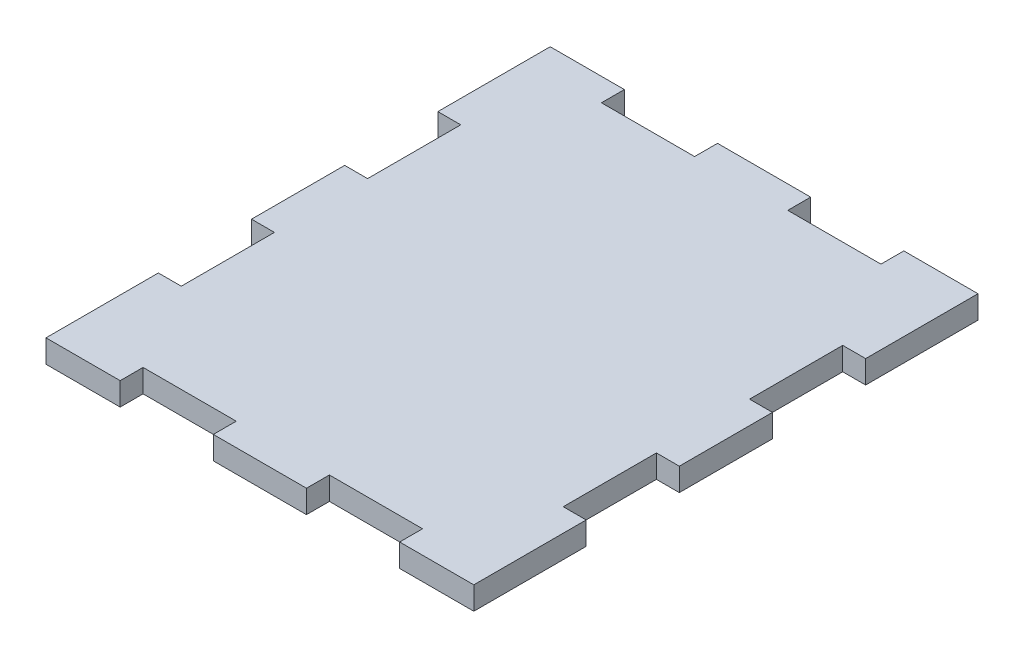
ISO-10303-21;
HEADER;
FILE_DESCRIPTION(('STEP AP214'),'2;1');
FILE_NAME('part.step','',(''),(''),'','','');
FILE_SCHEMA(('AUTOMOTIVE_DESIGN { 1 0 10303 214 1 1 1 1 }'));
ENDSEC;
DATA;
#1=APPLICATION_CONTEXT('core data for automotive mechanical design processes');
#2=APPLICATION_PROTOCOL_DEFINITION('international standard','automotive_design',2000,#1);
#3=PRODUCT_CONTEXT('',#1,'mechanical');
#4=PRODUCT('Part','Part','',(#3));
#5=PRODUCT_RELATED_PRODUCT_CATEGORY('part','',(#4));
#6=PRODUCT_DEFINITION_FORMATION('','',#4);
#7=PRODUCT_DEFINITION_CONTEXT('part definition',#1,'design');
#8=PRODUCT_DEFINITION('design','',#6,#7);
#9=PRODUCT_DEFINITION_SHAPE('','',#8);
#10=(LENGTH_UNIT() NAMED_UNIT(*) SI_UNIT(.MILLI.,.METRE.));
#11=(NAMED_UNIT(*) PLANE_ANGLE_UNIT() SI_UNIT($,.RADIAN.));
#12=(NAMED_UNIT(*) SI_UNIT($,.STERADIAN.) SOLID_ANGLE_UNIT());
#13=UNCERTAINTY_MEASURE_WITH_UNIT(LENGTH_MEASURE(1.E-05),#10,'distance_accuracy_value','');
#14=(GEOMETRIC_REPRESENTATION_CONTEXT(3) GLOBAL_UNCERTAINTY_ASSIGNED_CONTEXT((#13)) GLOBAL_UNIT_ASSIGNED_CONTEXT((#10,
#11,#12)) REPRESENTATION_CONTEXT('',''));
#15=CARTESIAN_POINT('',(0.,0.,0.));
#16=DIRECTION('',(0.,0.,1.));
#17=DIRECTION('',(1.,0.,0.));
#18=AXIS2_PLACEMENT_3D('',#15,#16,#17);
#19=CARTESIAN_POINT('',(19.415,6.,-270.));
#20=DIRECTION('',(0.,0.,1.));
#21=DIRECTION('',(1.,0.,0.));
#22=AXIS2_PLACEMENT_3D('',#19,#20,#21);
#23=PLANE('',#22);
#24=DIRECTION('',(-1.,0.,0.));
#25=VECTOR('',#24,1.);
#26=CARTESIAN_POINT('',(19.415,0.,-270.));
#27=LINE('',#26,#25);
#28=CARTESIAN_POINT('',(19.415,0.,-270.));
#29=VERTEX_POINT('',#28);
#30=CARTESIAN_POINT('',(0.,0.,-270.));
#31=VERTEX_POINT('',#30);
#32=EDGE_CURVE('E308',#29,#31,#27,.T.);
#33=ORIENTED_EDGE('',*,*,#32,.T.);
#34=DIRECTION('',(0.,-1.,0.));
#35=VECTOR('',#34,1.);
#36=CARTESIAN_POINT('',(0.,6.,-270.));
#37=LINE('',#36,#35);
#38=CARTESIAN_POINT('',(0.,6.,-270.));
#39=VERTEX_POINT('',#38);
#40=EDGE_CURVE('E11',#39,#31,#37,.T.);
#41=ORIENTED_EDGE('',*,*,#40,.F.);
#42=DIRECTION('',(-1.,0.,0.));
#43=VECTOR('',#42,1.);
#44=CARTESIAN_POINT('',(19.415,6.,-270.));
#45=LINE('',#44,#43);
#46=CARTESIAN_POINT('',(19.415,6.,-270.));
#47=VERTEX_POINT('',#46);
#48=EDGE_CURVE('E416',#47,#39,#45,.T.);
#49=ORIENTED_EDGE('',*,*,#48,.F.);
#50=DIRECTION('',(0.,-1.,0.));
#51=VECTOR('',#50,1.);
#52=CARTESIAN_POINT('',(19.415,6.,-270.));
#53=LINE('',#52,#51);
#54=EDGE_CURVE('E304',#47,#29,#53,.T.);
#55=ORIENTED_EDGE('',*,*,#54,.T.);
#56=EDGE_LOOP('',(#33,#41,#49,#55));
#57=FACE_BOUND('',#56,.T.);
#58=ADVANCED_FACE('F39',(#57),#23,.F.);
#59=CARTESIAN_POINT('',(0.,6.,-270.));
#60=DIRECTION('',(1.,0.,0.));
#61=DIRECTION('',(0.,0.,-1.));
#62=AXIS2_PLACEMENT_3D('',#59,#60,#61);
#63=PLANE('',#62);
#64=DIRECTION('',(0.,0.,1.));
#65=VECTOR('',#64,1.);
#66=CARTESIAN_POINT('',(0.,0.,-270.));
#67=LINE('',#66,#65);
#68=CARTESIAN_POINT('',(0.,0.,-240.585));
#69=VERTEX_POINT('',#68);
#70=EDGE_CURVE('E312',#31,#69,#67,.T.);
#71=ORIENTED_EDGE('',*,*,#70,.T.);
#72=DIRECTION('',(0.,-1.,0.));
#73=VECTOR('',#72,1.);
#74=CARTESIAN_POINT('',(0.,6.,-240.585));
#75=LINE('',#74,#73);
#76=CARTESIAN_POINT('',(0.,6.,-240.585));
#77=VERTEX_POINT('',#76);
#78=EDGE_CURVE('E48',#77,#69,#75,.T.);
#79=ORIENTED_EDGE('',*,*,#78,.F.);
#80=DIRECTION('',(0.,0.,1.));
#81=VECTOR('',#80,1.);
#82=CARTESIAN_POINT('',(0.,6.,-270.));
#83=LINE('',#82,#81);
#84=EDGE_CURVE('E183',#39,#77,#83,.T.);
#85=ORIENTED_EDGE('',*,*,#84,.F.);
#86=ORIENTED_EDGE('',*,*,#40,.T.);
#87=EDGE_LOOP('',(#71,#79,#85,#86));
#88=FACE_BOUND('',#87,.T.);
#89=ADVANCED_FACE('F678',(#88),#63,.F.);
#90=CARTESIAN_POINT('',(0.,6.,-240.585));
#91=DIRECTION('',(0.,0.,-1.));
#92=DIRECTION('',(-1.,0.,0.));
#93=AXIS2_PLACEMENT_3D('',#90,#91,#92);
#94=PLANE('',#93);
#95=DIRECTION('',(1.,0.,0.));
#96=VECTOR('',#95,1.);
#97=CARTESIAN_POINT('',(0.,0.,-240.585));
#98=LINE('',#97,#96);
#99=CARTESIAN_POINT('',(6.,0.,-240.585));
#100=VERTEX_POINT('',#99);
#101=EDGE_CURVE('E315',#69,#100,#98,.T.);
#102=ORIENTED_EDGE('',*,*,#101,.T.);
#103=DIRECTION('',(0.,-1.,0.));
#104=VECTOR('',#103,1.);
#105=CARTESIAN_POINT('',(6.,6.,-240.585));
#106=LINE('',#105,#104);
#107=CARTESIAN_POINT('',(6.,6.,-240.585));
#108=VERTEX_POINT('',#107);
#109=EDGE_CURVE('E539',#108,#100,#106,.T.);
#110=ORIENTED_EDGE('',*,*,#109,.F.);
#111=DIRECTION('',(1.,0.,0.));
#112=VECTOR('',#111,1.);
#113=CARTESIAN_POINT('',(0.,6.,-240.585));
#114=LINE('',#113,#112);
#115=EDGE_CURVE('E549',#77,#108,#114,.T.);
#116=ORIENTED_EDGE('',*,*,#115,.F.);
#117=ORIENTED_EDGE('',*,*,#78,.T.);
#118=EDGE_LOOP('',(#102,#110,#116,#117));
#119=FACE_BOUND('',#118,.T.);
#120=ADVANCED_FACE('F547',(#119),#94,.F.);
#121=CARTESIAN_POINT('',(6.,6.,-240.585));
#122=DIRECTION('',(1.,0.,0.));
#123=DIRECTION('',(0.,0.,-1.));
#124=AXIS2_PLACEMENT_3D('',#121,#122,#123);
#125=PLANE('',#124);
#126=DIRECTION('',(0.,0.,1.));
#127=VECTOR('',#126,1.);
#128=CARTESIAN_POINT('',(6.,0.,-240.585));
#129=LINE('',#128,#127);
#130=CARTESIAN_POINT('',(6.,0.,-216.195));
#131=VERTEX_POINT('',#130);
#132=EDGE_CURVE('E318',#100,#131,#129,.T.);
#133=ORIENTED_EDGE('',*,*,#132,.T.);
#134=DIRECTION('',(0.,-1.,0.));
#135=VECTOR('',#134,1.);
#136=CARTESIAN_POINT('',(6.,6.,-216.195));
#137=LINE('',#136,#135);
#138=CARTESIAN_POINT('',(6.,6.,-216.195));
#139=VERTEX_POINT('',#138);
#140=EDGE_CURVE('E535',#139,#131,#137,.T.);
#141=ORIENTED_EDGE('',*,*,#140,.F.);
#142=DIRECTION('',(0.,0.,1.));
#143=VECTOR('',#142,1.);
#144=CARTESIAN_POINT('',(6.,6.,-240.585));
#145=LINE('',#144,#143);
#146=EDGE_CURVE('E568',#108,#139,#145,.T.);
#147=ORIENTED_EDGE('',*,*,#146,.F.);
#148=ORIENTED_EDGE('',*,*,#109,.T.);
#149=EDGE_LOOP('',(#133,#141,#147,#148));
#150=FACE_BOUND('',#149,.T.);
#151=ADVANCED_FACE('F558',(#150),#125,.F.);
#152=CARTESIAN_POINT('',(6.,6.,-216.195));
#153=DIRECTION('',(0.,0.,1.));
#154=DIRECTION('',(1.,0.,0.));
#155=AXIS2_PLACEMENT_3D('',#152,#153,#154);
#156=PLANE('',#155);
#157=DIRECTION('',(-1.,0.,0.));
#158=VECTOR('',#157,1.);
#159=CARTESIAN_POINT('',(6.,0.,-216.195));
#160=LINE('',#159,#158);
#161=CARTESIAN_POINT('',(0.,0.,-216.195));
#162=VERTEX_POINT('',#161);
#163=EDGE_CURVE('E321',#131,#162,#160,.T.);
#164=ORIENTED_EDGE('',*,*,#163,.T.);
#165=DIRECTION('',(0.,-1.,0.));
#166=VECTOR('',#165,1.);
#167=CARTESIAN_POINT('',(0.,6.,-216.195));
#168=LINE('',#167,#166);
#169=CARTESIAN_POINT('',(0.,6.,-216.195));
#170=VERTEX_POINT('',#169);
#171=EDGE_CURVE('E531',#170,#162,#168,.T.);
#172=ORIENTED_EDGE('',*,*,#171,.F.);
#173=DIRECTION('',(-1.,0.,0.));
#174=VECTOR('',#173,1.);
#175=CARTESIAN_POINT('',(6.,6.,-216.195));
#176=LINE('',#175,#174);
#177=EDGE_CURVE('E564',#139,#170,#176,.T.);
#178=ORIENTED_EDGE('',*,*,#177,.F.);
#179=ORIENTED_EDGE('',*,*,#140,.T.);
#180=EDGE_LOOP('',(#164,#172,#178,#179));
#181=FACE_BOUND('',#180,.T.);
#182=ADVANCED_FACE('F562',(#181),#156,.F.);
#183=CARTESIAN_POINT('',(0.,6.,-216.195));
#184=DIRECTION('',(1.,0.,0.));
#185=DIRECTION('',(0.,0.,-1.));
#186=AXIS2_PLACEMENT_3D('',#183,#184,#185);
#187=PLANE('',#186);
#188=DIRECTION('',(0.,0.,1.));
#189=VECTOR('',#188,1.);
#190=CARTESIAN_POINT('',(0.,0.,-216.195));
#191=LINE('',#190,#189);
#192=CARTESIAN_POINT('',(0.,0.,-191.805));
#193=VERTEX_POINT('',#192);
#194=EDGE_CURVE('E324',#162,#193,#191,.T.);
#195=ORIENTED_EDGE('',*,*,#194,.T.);
#196=DIRECTION('',(0.,-1.,0.));
#197=VECTOR('',#196,1.);
#198=CARTESIAN_POINT('',(0.,6.,-191.805));
#199=LINE('',#198,#197);
#200=CARTESIAN_POINT('',(0.,6.,-191.805));
#201=VERTEX_POINT('',#200);
#202=EDGE_CURVE('E527',#201,#193,#199,.T.);
#203=ORIENTED_EDGE('',*,*,#202,.F.);
#204=DIRECTION('',(0.,0.,1.));
#205=VECTOR('',#204,1.);
#206=CARTESIAN_POINT('',(0.,6.,-216.195));
#207=LINE('',#206,#205);
#208=EDGE_CURVE('E567',#170,#201,#207,.T.);
#209=ORIENTED_EDGE('',*,*,#208,.F.);
#210=ORIENTED_EDGE('',*,*,#171,.T.);
#211=EDGE_LOOP('',(#195,#203,#209,#210));
#212=FACE_BOUND('',#211,.T.);
#213=ADVANCED_FACE('F691',(#212),#187,.F.);
#214=CARTESIAN_POINT('',(0.,6.,-191.805));
#215=DIRECTION('',(0.,0.,-1.));
#216=DIRECTION('',(-1.,0.,0.));
#217=AXIS2_PLACEMENT_3D('',#214,#215,#216);
#218=PLANE('',#217);
#219=DIRECTION('',(1.,0.,0.));
#220=VECTOR('',#219,1.);
#221=CARTESIAN_POINT('',(0.,0.,-191.805));
#222=LINE('',#221,#220);
#223=CARTESIAN_POINT('',(6.,0.,-191.805));
#224=VERTEX_POINT('',#223);
#225=EDGE_CURVE('E327',#193,#224,#222,.T.);
#226=ORIENTED_EDGE('',*,*,#225,.T.);
#227=DIRECTION('',(0.,-1.,0.));
#228=VECTOR('',#227,1.);
#229=CARTESIAN_POINT('',(6.,6.,-191.805));
#230=LINE('',#229,#228);
#231=CARTESIAN_POINT('',(6.,6.,-191.805));
#232=VERTEX_POINT('',#231);
#233=EDGE_CURVE('E523',#232,#224,#230,.T.);
#234=ORIENTED_EDGE('',*,*,#233,.F.);
#235=DIRECTION('',(1.,0.,0.));
#236=VECTOR('',#235,1.);
#237=CARTESIAN_POINT('',(0.,6.,-191.805));
#238=LINE('',#237,#236);
#239=EDGE_CURVE('E572',#201,#232,#238,.T.);
#240=ORIENTED_EDGE('',*,*,#239,.F.);
#241=ORIENTED_EDGE('',*,*,#202,.T.);
#242=EDGE_LOOP('',(#226,#234,#240,#241));
#243=FACE_BOUND('',#242,.T.);
#244=ADVANCED_FACE('F694',(#243),#218,.F.);
#245=CARTESIAN_POINT('',(6.,6.,-191.805));
#246=DIRECTION('',(1.,0.,0.));
#247=DIRECTION('',(0.,0.,-1.));
#248=AXIS2_PLACEMENT_3D('',#245,#246,#247);
#249=PLANE('',#248);
#250=DIRECTION('',(0.,0.,1.));
#251=VECTOR('',#250,1.);
#252=CARTESIAN_POINT('',(6.,0.,-191.805));
#253=LINE('',#252,#251);
#254=CARTESIAN_POINT('',(6.,0.,-167.415));
#255=VERTEX_POINT('',#254);
#256=EDGE_CURVE('E330',#224,#255,#253,.T.);
#257=ORIENTED_EDGE('',*,*,#256,.T.);
#258=DIRECTION('',(0.,-1.,0.));
#259=VECTOR('',#258,1.);
#260=CARTESIAN_POINT('',(6.,6.,-167.415));
#261=LINE('',#260,#259);
#262=CARTESIAN_POINT('',(6.,6.,-167.415));
#263=VERTEX_POINT('',#262);
#264=EDGE_CURVE('E519',#263,#255,#261,.T.);
#265=ORIENTED_EDGE('',*,*,#264,.F.);
#266=DIRECTION('',(0.,0.,1.));
#267=VECTOR('',#266,1.);
#268=CARTESIAN_POINT('',(6.,6.,-191.805));
#269=LINE('',#268,#267);
#270=EDGE_CURVE('E579',#232,#263,#269,.T.);
#271=ORIENTED_EDGE('',*,*,#270,.F.);
#272=ORIENTED_EDGE('',*,*,#233,.T.);
#273=EDGE_LOOP('',(#257,#265,#271,#272));
#274=FACE_BOUND('',#273,.T.);
#275=ADVANCED_FACE('F698',(#274),#249,.F.);
#276=CARTESIAN_POINT('',(6.,6.,-167.415));
#277=DIRECTION('',(0.,0.,1.));
#278=DIRECTION('',(1.,0.,0.));
#279=AXIS2_PLACEMENT_3D('',#276,#277,#278);
#280=PLANE('',#279);
#281=DIRECTION('',(-1.,0.,0.));
#282=VECTOR('',#281,1.);
#283=CARTESIAN_POINT('',(6.,0.,-167.415));
#284=LINE('',#283,#282);
#285=CARTESIAN_POINT('',(0.,0.,-167.415));
#286=VERTEX_POINT('',#285);
#287=EDGE_CURVE('E333',#255,#286,#284,.T.);
#288=ORIENTED_EDGE('',*,*,#287,.T.);
#289=DIRECTION('',(0.,-1.,0.));
#290=VECTOR('',#289,1.);
#291=CARTESIAN_POINT('',(0.,6.,-167.415));
#292=LINE('',#291,#290);
#293=CARTESIAN_POINT('',(0.,6.,-167.415));
#294=VERTEX_POINT('',#293);
#295=EDGE_CURVE('E515',#294,#286,#292,.T.);
#296=ORIENTED_EDGE('',*,*,#295,.F.);
#297=DIRECTION('',(-1.,0.,0.));
#298=VECTOR('',#297,1.);
#299=CARTESIAN_POINT('',(6.,6.,-167.415));
#300=LINE('',#299,#298);
#301=EDGE_CURVE('E582',#263,#294,#300,.T.);
#302=ORIENTED_EDGE('',*,*,#301,.F.);
#303=ORIENTED_EDGE('',*,*,#264,.T.);
#304=EDGE_LOOP('',(#288,#296,#302,#303));
#305=FACE_BOUND('',#304,.T.);
#306=ADVANCED_FACE('F702',(#305),#280,.F.);
#307=CARTESIAN_POINT('',(0.,6.,-143.025));
#308=DIRECTION('',(1.,0.,0.));
#309=DIRECTION('',(0.,0.,-1.));
#310=AXIS2_PLACEMENT_3D('',#307,#308,#309);
#311=PLANE('',#310);
#312=DIRECTION('',(0.,0.,1.));
#313=VECTOR('',#312,1.);
#314=CARTESIAN_POINT('',(0.,0.,-143.025));
#315=LINE('',#314,#313);
#316=CARTESIAN_POINT('',(0.,0.,-138.));
#317=VERTEX_POINT('',#316);
#318=EDGE_CURVE('E337',#286,#317,#315,.T.);
#319=ORIENTED_EDGE('',*,*,#318,.T.);
#320=DIRECTION('',(0.,-1.,0.));
#321=VECTOR('',#320,1.);
#322=CARTESIAN_POINT('',(0.,6.,-138.));
#323=LINE('',#322,#321);
#324=CARTESIAN_POINT('',(0.,6.,-138.));
#325=VERTEX_POINT('',#324);
#326=EDGE_CURVE('E511',#325,#317,#323,.T.);
#327=ORIENTED_EDGE('',*,*,#326,.F.);
#328=DIRECTION('',(0.,0.,1.));
#329=VECTOR('',#328,1.);
#330=CARTESIAN_POINT('',(0.,6.,-167.415));
#331=LINE('',#330,#329);
#332=EDGE_CURVE('E585',#294,#325,#331,.T.);
#333=ORIENTED_EDGE('',*,*,#332,.F.);
#334=ORIENTED_EDGE('',*,*,#295,.T.);
#335=EDGE_LOOP('',(#319,#327,#333,#334));
#336=FACE_BOUND('',#335,.T.);
#337=ADVANCED_FACE('F706',(#336),#311,.F.);
#338=CARTESIAN_POINT('',(0.,6.,-138.));
#339=DIRECTION('',(0.,0.,-1.));
#340=DIRECTION('',(-1.,0.,0.));
#341=AXIS2_PLACEMENT_3D('',#338,#339,#340);
#342=PLANE('',#341);
#343=DIRECTION('',(1.,0.,0.));
#344=VECTOR('',#343,1.);
#345=CARTESIAN_POINT('',(0.,0.,-138.));
#346=LINE('',#345,#344);
#347=CARTESIAN_POINT('',(19.415,0.,-138.));
#348=VERTEX_POINT('',#347);
#349=EDGE_CURVE('E340',#317,#348,#346,.T.);
#350=ORIENTED_EDGE('',*,*,#349,.T.);
#351=DIRECTION('',(0.,-1.,0.));
#352=VECTOR('',#351,1.);
#353=CARTESIAN_POINT('',(19.415,6.,-138.));
#354=LINE('',#353,#352);
#355=CARTESIAN_POINT('',(19.415,6.,-138.));
#356=VERTEX_POINT('',#355);
#357=EDGE_CURVE('E507',#356,#348,#354,.T.);
#358=ORIENTED_EDGE('',*,*,#357,.F.);
#359=DIRECTION('',(1.,0.,0.));
#360=VECTOR('',#359,1.);
#361=CARTESIAN_POINT('',(0.,6.,-138.));
#362=LINE('',#361,#360);
#363=EDGE_CURVE('E588',#325,#356,#362,.T.);
#364=ORIENTED_EDGE('',*,*,#363,.F.);
#365=ORIENTED_EDGE('',*,*,#326,.T.);
#366=EDGE_LOOP('',(#350,#358,#364,#365));
#367=FACE_BOUND('',#366,.T.);
#368=ADVANCED_FACE('F710',(#367),#342,.F.);
#369=CARTESIAN_POINT('',(19.415,6.,-138.));
#370=DIRECTION('',(-1.,0.,0.));
#371=DIRECTION('',(0.,0.,1.));
#372=AXIS2_PLACEMENT_3D('',#369,#370,#371);
#373=PLANE('',#372);
#374=DIRECTION('',(0.,0.,-1.));
#375=VECTOR('',#374,1.);
#376=CARTESIAN_POINT('',(19.415,0.,-138.));
#377=LINE('',#376,#375);
#378=CARTESIAN_POINT('',(19.415,0.,-144.));
#379=VERTEX_POINT('',#378);
#380=EDGE_CURVE('E343',#348,#379,#377,.T.);
#381=ORIENTED_EDGE('',*,*,#380,.T.);
#382=DIRECTION('',(0.,-1.,0.));
#383=VECTOR('',#382,1.);
#384=CARTESIAN_POINT('',(19.415,6.,-144.));
#385=LINE('',#384,#383);
#386=CARTESIAN_POINT('',(19.415,6.,-144.));
#387=VERTEX_POINT('',#386);
#388=EDGE_CURVE('E503',#387,#379,#385,.T.);
#389=ORIENTED_EDGE('',*,*,#388,.F.);
#390=DIRECTION('',(0.,0.,-1.));
#391=VECTOR('',#390,1.);
#392=CARTESIAN_POINT('',(19.415,6.,-138.));
#393=LINE('',#392,#391);
#394=EDGE_CURVE('E591',#356,#387,#393,.T.);
#395=ORIENTED_EDGE('',*,*,#394,.F.);
#396=ORIENTED_EDGE('',*,*,#357,.T.);
#397=EDGE_LOOP('',(#381,#389,#395,#396));
#398=FACE_BOUND('',#397,.T.);
#399=ADVANCED_FACE('F714',(#398),#373,.F.);
#400=CARTESIAN_POINT('',(19.415,6.,-144.));
#401=DIRECTION('',(0.,0.,-1.));
#402=DIRECTION('',(-1.,0.,0.));
#403=AXIS2_PLACEMENT_3D('',#400,#401,#402);
#404=PLANE('',#403);
#405=DIRECTION('',(1.,0.,0.));
#406=VECTOR('',#405,1.);
#407=CARTESIAN_POINT('',(19.415,0.,-144.));
#408=LINE('',#407,#406);
#409=CARTESIAN_POINT('',(43.805,0.,-144.));
#410=VERTEX_POINT('',#409);
#411=EDGE_CURVE('E346',#379,#410,#408,.T.);
#412=ORIENTED_EDGE('',*,*,#411,.T.);
#413=DIRECTION('',(0.,-1.,0.));
#414=VECTOR('',#413,1.);
#415=CARTESIAN_POINT('',(43.805,6.,-144.));
#416=LINE('',#415,#414);
#417=CARTESIAN_POINT('',(43.805,6.,-144.));
#418=VERTEX_POINT('',#417);
#419=EDGE_CURVE('E499',#418,#410,#416,.T.);
#420=ORIENTED_EDGE('',*,*,#419,.F.);
#421=DIRECTION('',(1.,0.,0.));
#422=VECTOR('',#421,1.);
#423=CARTESIAN_POINT('',(19.415,6.,-144.));
#424=LINE('',#423,#422);
#425=EDGE_CURVE('E594',#387,#418,#424,.T.);
#426=ORIENTED_EDGE('',*,*,#425,.F.);
#427=ORIENTED_EDGE('',*,*,#388,.T.);
#428=EDGE_LOOP('',(#412,#420,#426,#427));
#429=FACE_BOUND('',#428,.T.);
#430=ADVANCED_FACE('F718',(#429),#404,.F.);
#431=CARTESIAN_POINT('',(43.805,6.,-144.));
#432=DIRECTION('',(1.,0.,0.));
#433=DIRECTION('',(0.,0.,-1.));
#434=AXIS2_PLACEMENT_3D('',#431,#432,#433);
#435=PLANE('',#434);
#436=DIRECTION('',(0.,0.,1.));
#437=VECTOR('',#436,1.);
#438=CARTESIAN_POINT('',(43.805,0.,-144.));
#439=LINE('',#438,#437);
#440=CARTESIAN_POINT('',(43.805,0.,-138.));
#441=VERTEX_POINT('',#440);
#442=EDGE_CURVE('E349',#410,#441,#439,.T.);
#443=ORIENTED_EDGE('',*,*,#442,.T.);
#444=DIRECTION('',(0.,-1.,0.));
#445=VECTOR('',#444,1.);
#446=CARTESIAN_POINT('',(43.805,6.,-138.));
#447=LINE('',#446,#445);
#448=CARTESIAN_POINT('',(43.805,6.,-138.));
#449=VERTEX_POINT('',#448);
#450=EDGE_CURVE('E495',#449,#441,#447,.T.);
#451=ORIENTED_EDGE('',*,*,#450,.F.);
#452=DIRECTION('',(0.,0.,1.));
#453=VECTOR('',#452,1.);
#454=CARTESIAN_POINT('',(43.805,6.,-144.));
#455=LINE('',#454,#453);
#456=EDGE_CURVE('E597',#418,#449,#455,.T.);
#457=ORIENTED_EDGE('',*,*,#456,.F.);
#458=ORIENTED_EDGE('',*,*,#419,.T.);
#459=EDGE_LOOP('',(#443,#451,#457,#458));
#460=FACE_BOUND('',#459,.T.);
#461=ADVANCED_FACE('F722',(#460),#435,.F.);
#462=CARTESIAN_POINT('',(43.805,6.,-138.));
#463=DIRECTION('',(0.,0.,-1.));
#464=DIRECTION('',(-1.,0.,0.));
#465=AXIS2_PLACEMENT_3D('',#462,#463,#464);
#466=PLANE('',#465);
#467=DIRECTION('',(1.,0.,0.));
#468=VECTOR('',#467,1.);
#469=CARTESIAN_POINT('',(43.805,0.,-138.));
#470=LINE('',#469,#468);
#471=CARTESIAN_POINT('',(68.195,0.,-138.));
#472=VERTEX_POINT('',#471);
#473=EDGE_CURVE('E352',#441,#472,#470,.T.);
#474=ORIENTED_EDGE('',*,*,#473,.T.);
#475=DIRECTION('',(0.,-1.,0.));
#476=VECTOR('',#475,1.);
#477=CARTESIAN_POINT('',(68.195,6.,-138.));
#478=LINE('',#477,#476);
#479=CARTESIAN_POINT('',(68.195,6.,-138.));
#480=VERTEX_POINT('',#479);
#481=EDGE_CURVE('E491',#480,#472,#478,.T.);
#482=ORIENTED_EDGE('',*,*,#481,.F.);
#483=DIRECTION('',(1.,0.,0.));
#484=VECTOR('',#483,1.);
#485=CARTESIAN_POINT('',(43.805,6.,-138.));
#486=LINE('',#485,#484);
#487=EDGE_CURVE('E600',#449,#480,#486,.T.);
#488=ORIENTED_EDGE('',*,*,#487,.F.);
#489=ORIENTED_EDGE('',*,*,#450,.T.);
#490=EDGE_LOOP('',(#474,#482,#488,#489));
#491=FACE_BOUND('',#490,.T.);
#492=ADVANCED_FACE('F726',(#491),#466,.F.);
#493=CARTESIAN_POINT('',(68.195,6.,-138.));
#494=DIRECTION('',(-1.,0.,0.));
#495=DIRECTION('',(0.,0.,1.));
#496=AXIS2_PLACEMENT_3D('',#493,#494,#495);
#497=PLANE('',#496);
#498=DIRECTION('',(0.,0.,-1.));
#499=VECTOR('',#498,1.);
#500=CARTESIAN_POINT('',(68.195,0.,-138.));
#501=LINE('',#500,#499);
#502=CARTESIAN_POINT('',(68.195,0.,-144.));
#503=VERTEX_POINT('',#502);
#504=EDGE_CURVE('E355',#472,#503,#501,.T.);
#505=ORIENTED_EDGE('',*,*,#504,.T.);
#506=DIRECTION('',(0.,-1.,0.));
#507=VECTOR('',#506,1.);
#508=CARTESIAN_POINT('',(68.195,6.,-144.));
#509=LINE('',#508,#507);
#510=CARTESIAN_POINT('',(68.195,6.,-144.));
#511=VERTEX_POINT('',#510);
#512=EDGE_CURVE('E487',#511,#503,#509,.T.);
#513=ORIENTED_EDGE('',*,*,#512,.F.);
#514=DIRECTION('',(0.,0.,-1.));
#515=VECTOR('',#514,1.);
#516=CARTESIAN_POINT('',(68.195,6.,-138.));
#517=LINE('',#516,#515);
#518=EDGE_CURVE('E603',#480,#511,#517,.T.);
#519=ORIENTED_EDGE('',*,*,#518,.F.);
#520=ORIENTED_EDGE('',*,*,#481,.T.);
#521=EDGE_LOOP('',(#505,#513,#519,#520));
#522=FACE_BOUND('',#521,.T.);
#523=ADVANCED_FACE('F730',(#522),#497,.F.);
#524=CARTESIAN_POINT('',(68.195,6.,-144.));
#525=DIRECTION('',(0.,0.,-1.));
#526=DIRECTION('',(-1.,0.,0.));
#527=AXIS2_PLACEMENT_3D('',#524,#525,#526);
#528=PLANE('',#527);
#529=DIRECTION('',(1.,0.,0.));
#530=VECTOR('',#529,1.);
#531=CARTESIAN_POINT('',(68.195,0.,-144.));
#532=LINE('',#531,#530);
#533=CARTESIAN_POINT('',(92.585,0.,-144.));
#534=VERTEX_POINT('',#533);
#535=EDGE_CURVE('E358',#503,#534,#532,.T.);
#536=ORIENTED_EDGE('',*,*,#535,.T.);
#537=DIRECTION('',(0.,-1.,0.));
#538=VECTOR('',#537,1.);
#539=CARTESIAN_POINT('',(92.585,6.,-144.));
#540=LINE('',#539,#538);
#541=CARTESIAN_POINT('',(92.585,6.,-144.));
#542=VERTEX_POINT('',#541);
#543=EDGE_CURVE('E483',#542,#534,#540,.T.);
#544=ORIENTED_EDGE('',*,*,#543,.F.);
#545=DIRECTION('',(1.,0.,0.));
#546=VECTOR('',#545,1.);
#547=CARTESIAN_POINT('',(68.195,6.,-144.));
#548=LINE('',#547,#546);
#549=EDGE_CURVE('E606',#511,#542,#548,.T.);
#550=ORIENTED_EDGE('',*,*,#549,.F.);
#551=ORIENTED_EDGE('',*,*,#512,.T.);
#552=EDGE_LOOP('',(#536,#544,#550,#551));
#553=FACE_BOUND('',#552,.T.);
#554=ADVANCED_FACE('F734',(#553),#528,.F.);
#555=CARTESIAN_POINT('',(92.585,6.,-144.));
#556=DIRECTION('',(1.,0.,0.));
#557=DIRECTION('',(0.,0.,-1.));
#558=AXIS2_PLACEMENT_3D('',#555,#556,#557);
#559=PLANE('',#558);
#560=DIRECTION('',(0.,0.,1.));
#561=VECTOR('',#560,1.);
#562=CARTESIAN_POINT('',(92.585,0.,-144.));
#563=LINE('',#562,#561);
#564=CARTESIAN_POINT('',(92.585,0.,-138.));
#565=VERTEX_POINT('',#564);
#566=EDGE_CURVE('E361',#534,#565,#563,.T.);
#567=ORIENTED_EDGE('',*,*,#566,.T.);
#568=DIRECTION('',(0.,-1.,0.));
#569=VECTOR('',#568,1.);
#570=CARTESIAN_POINT('',(92.585,6.,-138.));
#571=LINE('',#570,#569);
#572=CARTESIAN_POINT('',(92.585,6.,-138.));
#573=VERTEX_POINT('',#572);
#574=EDGE_CURVE('E479',#573,#565,#571,.T.);
#575=ORIENTED_EDGE('',*,*,#574,.F.);
#576=DIRECTION('',(0.,0.,1.));
#577=VECTOR('',#576,1.);
#578=CARTESIAN_POINT('',(92.585,6.,-144.));
#579=LINE('',#578,#577);
#580=EDGE_CURVE('E609',#542,#573,#579,.T.);
#581=ORIENTED_EDGE('',*,*,#580,.F.);
#582=ORIENTED_EDGE('',*,*,#543,.T.);
#583=EDGE_LOOP('',(#567,#575,#581,#582));
#584=FACE_BOUND('',#583,.T.);
#585=ADVANCED_FACE('F738',(#584),#559,.F.);
#586=CARTESIAN_POINT('',(92.585,6.,-138.));
#587=DIRECTION('',(0.,0.,-1.));
#588=DIRECTION('',(-1.,0.,0.));
#589=AXIS2_PLACEMENT_3D('',#586,#587,#588);
#590=PLANE('',#589);
#591=DIRECTION('',(1.,0.,0.));
#592=VECTOR('',#591,1.);
#593=CARTESIAN_POINT('',(92.585,0.,-138.));
#594=LINE('',#593,#592);
#595=CARTESIAN_POINT('',(112.,0.,-138.));
#596=VERTEX_POINT('',#595);
#597=EDGE_CURVE('E364',#565,#596,#594,.T.);
#598=ORIENTED_EDGE('',*,*,#597,.T.);
#599=DIRECTION('',(0.,-1.,0.));
#600=VECTOR('',#599,1.);
#601=CARTESIAN_POINT('',(112.,6.,-138.));
#602=LINE('',#601,#600);
#603=CARTESIAN_POINT('',(112.,6.,-138.));
#604=VERTEX_POINT('',#603);
#605=EDGE_CURVE('E475',#604,#596,#602,.T.);
#606=ORIENTED_EDGE('',*,*,#605,.F.);
#607=DIRECTION('',(1.,0.,0.));
#608=VECTOR('',#607,1.);
#609=CARTESIAN_POINT('',(92.585,6.,-138.));
#610=LINE('',#609,#608);
#611=EDGE_CURVE('E612',#573,#604,#610,.T.);
#612=ORIENTED_EDGE('',*,*,#611,.F.);
#613=ORIENTED_EDGE('',*,*,#574,.T.);
#614=EDGE_LOOP('',(#598,#606,#612,#613));
#615=FACE_BOUND('',#614,.T.);
#616=ADVANCED_FACE('F742',(#615),#590,.F.);
#617=CARTESIAN_POINT('',(112.,6.,-138.));
#618=DIRECTION('',(-1.,0.,0.));
#619=DIRECTION('',(0.,0.,1.));
#620=AXIS2_PLACEMENT_3D('',#617,#618,#619);
#621=PLANE('',#620);
#622=DIRECTION('',(0.,0.,-1.));
#623=VECTOR('',#622,1.);
#624=CARTESIAN_POINT('',(112.,0.,-138.));
#625=LINE('',#624,#623);
#626=CARTESIAN_POINT('',(112.,0.,-167.415));
#627=VERTEX_POINT('',#626);
#628=EDGE_CURVE('E367',#596,#627,#625,.T.);
#629=ORIENTED_EDGE('',*,*,#628,.T.);
#630=DIRECTION('',(0.,-1.,0.));
#631=VECTOR('',#630,1.);
#632=CARTESIAN_POINT('',(112.,6.,-167.415));
#633=LINE('',#632,#631);
#634=CARTESIAN_POINT('',(112.,6.,-167.415));
#635=VERTEX_POINT('',#634);
#636=EDGE_CURVE('E471',#635,#627,#633,.T.);
#637=ORIENTED_EDGE('',*,*,#636,.F.);
#638=DIRECTION('',(0.,0.,-1.));
#639=VECTOR('',#638,1.);
#640=CARTESIAN_POINT('',(112.,6.,-138.));
#641=LINE('',#640,#639);
#642=EDGE_CURVE('E615',#604,#635,#641,.T.);
#643=ORIENTED_EDGE('',*,*,#642,.F.);
#644=ORIENTED_EDGE('',*,*,#605,.T.);
#645=EDGE_LOOP('',(#629,#637,#643,#644));
#646=FACE_BOUND('',#645,.T.);
#647=ADVANCED_FACE('F746',(#646),#621,.F.);
#648=CARTESIAN_POINT('',(112.,6.,-167.415));
#649=DIRECTION('',(0.,0.,1.));
#650=DIRECTION('',(1.,0.,0.));
#651=AXIS2_PLACEMENT_3D('',#648,#649,#650);
#652=PLANE('',#651);
#653=DIRECTION('',(-1.,0.,0.));
#654=VECTOR('',#653,1.);
#655=CARTESIAN_POINT('',(112.,0.,-167.415));
#656=LINE('',#655,#654);
#657=CARTESIAN_POINT('',(106.,0.,-167.415));
#658=VERTEX_POINT('',#657);
#659=EDGE_CURVE('E370',#627,#658,#656,.T.);
#660=ORIENTED_EDGE('',*,*,#659,.T.);
#661=DIRECTION('',(0.,-1.,0.));
#662=VECTOR('',#661,1.);
#663=CARTESIAN_POINT('',(106.,6.,-167.415));
#664=LINE('',#663,#662);
#665=CARTESIAN_POINT('',(106.,6.,-167.415));
#666=VERTEX_POINT('',#665);
#667=EDGE_CURVE('E467',#666,#658,#664,.T.);
#668=ORIENTED_EDGE('',*,*,#667,.F.);
#669=DIRECTION('',(-1.,0.,0.));
#670=VECTOR('',#669,1.);
#671=CARTESIAN_POINT('',(112.,6.,-167.415));
#672=LINE('',#671,#670);
#673=EDGE_CURVE('E618',#635,#666,#672,.T.);
#674=ORIENTED_EDGE('',*,*,#673,.F.);
#675=ORIENTED_EDGE('',*,*,#636,.T.);
#676=EDGE_LOOP('',(#660,#668,#674,#675));
#677=FACE_BOUND('',#676,.T.);
#678=ADVANCED_FACE('F750',(#677),#652,.F.);
#679=CARTESIAN_POINT('',(106.,6.,-167.415));
#680=DIRECTION('',(-1.,0.,0.));
#681=DIRECTION('',(0.,0.,1.));
#682=AXIS2_PLACEMENT_3D('',#679,#680,#681);
#683=PLANE('',#682);
#684=DIRECTION('',(0.,0.,-1.));
#685=VECTOR('',#684,1.);
#686=CARTESIAN_POINT('',(106.,0.,-167.415));
#687=LINE('',#686,#685);
#688=CARTESIAN_POINT('',(106.,0.,-191.805));
#689=VERTEX_POINT('',#688);
#690=EDGE_CURVE('E373',#658,#689,#687,.T.);
#691=ORIENTED_EDGE('',*,*,#690,.T.);
#692=DIRECTION('',(0.,-1.,0.));
#693=VECTOR('',#692,1.);
#694=CARTESIAN_POINT('',(106.,6.,-191.805));
#695=LINE('',#694,#693);
#696=CARTESIAN_POINT('',(106.,6.,-191.805));
#697=VERTEX_POINT('',#696);
#698=EDGE_CURVE('E463',#697,#689,#695,.T.);
#699=ORIENTED_EDGE('',*,*,#698,.F.);
#700=DIRECTION('',(0.,0.,-1.));
#701=VECTOR('',#700,1.);
#702=CARTESIAN_POINT('',(106.,6.,-167.415));
#703=LINE('',#702,#701);
#704=EDGE_CURVE('E621',#666,#697,#703,.T.);
#705=ORIENTED_EDGE('',*,*,#704,.F.);
#706=ORIENTED_EDGE('',*,*,#667,.T.);
#707=EDGE_LOOP('',(#691,#699,#705,#706));
#708=FACE_BOUND('',#707,.T.);
#709=ADVANCED_FACE('F754',(#708),#683,.F.);
#710=CARTESIAN_POINT('',(106.,6.,-191.805));
#711=DIRECTION('',(0.,0.,-1.));
#712=DIRECTION('',(-1.,0.,0.));
#713=AXIS2_PLACEMENT_3D('',#710,#711,#712);
#714=PLANE('',#713);
#715=DIRECTION('',(1.,0.,0.));
#716=VECTOR('',#715,1.);
#717=CARTESIAN_POINT('',(106.,0.,-191.805));
#718=LINE('',#717,#716);
#719=CARTESIAN_POINT('',(112.,0.,-191.805));
#720=VERTEX_POINT('',#719);
#721=EDGE_CURVE('E376',#689,#720,#718,.T.);
#722=ORIENTED_EDGE('',*,*,#721,.T.);
#723=DIRECTION('',(0.,-1.,0.));
#724=VECTOR('',#723,1.);
#725=CARTESIAN_POINT('',(112.,6.,-191.805));
#726=LINE('',#725,#724);
#727=CARTESIAN_POINT('',(112.,6.,-191.805));
#728=VERTEX_POINT('',#727);
#729=EDGE_CURVE('E459',#728,#720,#726,.T.);
#730=ORIENTED_EDGE('',*,*,#729,.F.);
#731=DIRECTION('',(1.,0.,0.));
#732=VECTOR('',#731,1.);
#733=CARTESIAN_POINT('',(106.,6.,-191.805));
#734=LINE('',#733,#732);
#735=EDGE_CURVE('E624',#697,#728,#734,.T.);
#736=ORIENTED_EDGE('',*,*,#735,.F.);
#737=ORIENTED_EDGE('',*,*,#698,.T.);
#738=EDGE_LOOP('',(#722,#730,#736,#737));
#739=FACE_BOUND('',#738,.T.);
#740=ADVANCED_FACE('F758',(#739),#714,.F.);
#741=CARTESIAN_POINT('',(112.,6.,-191.805));
#742=DIRECTION('',(-1.,0.,0.));
#743=DIRECTION('',(0.,0.,1.));
#744=AXIS2_PLACEMENT_3D('',#741,#742,#743);
#745=PLANE('',#744);
#746=DIRECTION('',(0.,0.,-1.));
#747=VECTOR('',#746,1.);
#748=CARTESIAN_POINT('',(112.,0.,-191.805));
#749=LINE('',#748,#747);
#750=CARTESIAN_POINT('',(112.,0.,-216.195));
#751=VERTEX_POINT('',#750);
#752=EDGE_CURVE('E379',#720,#751,#749,.T.);
#753=ORIENTED_EDGE('',*,*,#752,.T.);
#754=DIRECTION('',(0.,-1.,0.));
#755=VECTOR('',#754,1.);
#756=CARTESIAN_POINT('',(112.,6.,-216.195));
#757=LINE('',#756,#755);
#758=CARTESIAN_POINT('',(112.,6.,-216.195));
#759=VERTEX_POINT('',#758);
#760=EDGE_CURVE('E455',#759,#751,#757,.T.);
#761=ORIENTED_EDGE('',*,*,#760,.F.);
#762=DIRECTION('',(0.,0.,-1.));
#763=VECTOR('',#762,1.);
#764=CARTESIAN_POINT('',(112.,6.,-191.805));
#765=LINE('',#764,#763);
#766=EDGE_CURVE('E627',#728,#759,#765,.T.);
#767=ORIENTED_EDGE('',*,*,#766,.F.);
#768=ORIENTED_EDGE('',*,*,#729,.T.);
#769=EDGE_LOOP('',(#753,#761,#767,#768));
#770=FACE_BOUND('',#769,.T.);
#771=ADVANCED_FACE('F762',(#770),#745,.F.);
#772=CARTESIAN_POINT('',(112.,6.,-216.195));
#773=DIRECTION('',(0.,0.,1.));
#774=DIRECTION('',(1.,0.,0.));
#775=AXIS2_PLACEMENT_3D('',#772,#773,#774);
#776=PLANE('',#775);
#777=DIRECTION('',(-1.,0.,0.));
#778=VECTOR('',#777,1.);
#779=CARTESIAN_POINT('',(112.,0.,-216.195));
#780=LINE('',#779,#778);
#781=CARTESIAN_POINT('',(106.,0.,-216.195));
#782=VERTEX_POINT('',#781);
#783=EDGE_CURVE('E382',#751,#782,#780,.T.);
#784=ORIENTED_EDGE('',*,*,#783,.T.);
#785=DIRECTION('',(0.,-1.,0.));
#786=VECTOR('',#785,1.);
#787=CARTESIAN_POINT('',(106.,6.,-216.195));
#788=LINE('',#787,#786);
#789=CARTESIAN_POINT('',(106.,6.,-216.195));
#790=VERTEX_POINT('',#789);
#791=EDGE_CURVE('E451',#790,#782,#788,.T.);
#792=ORIENTED_EDGE('',*,*,#791,.F.);
#793=DIRECTION('',(-1.,0.,0.));
#794=VECTOR('',#793,1.);
#795=CARTESIAN_POINT('',(112.,6.,-216.195));
#796=LINE('',#795,#794);
#797=EDGE_CURVE('E630',#759,#790,#796,.T.);
#798=ORIENTED_EDGE('',*,*,#797,.F.);
#799=ORIENTED_EDGE('',*,*,#760,.T.);
#800=EDGE_LOOP('',(#784,#792,#798,#799));
#801=FACE_BOUND('',#800,.T.);
#802=ADVANCED_FACE('F766',(#801),#776,.F.);
#803=CARTESIAN_POINT('',(106.,6.,-216.195));
#804=DIRECTION('',(-1.,0.,0.));
#805=DIRECTION('',(0.,0.,1.));
#806=AXIS2_PLACEMENT_3D('',#803,#804,#805);
#807=PLANE('',#806);
#808=DIRECTION('',(0.,0.,-1.));
#809=VECTOR('',#808,1.);
#810=CARTESIAN_POINT('',(106.,0.,-216.195));
#811=LINE('',#810,#809);
#812=CARTESIAN_POINT('',(106.,0.,-240.585));
#813=VERTEX_POINT('',#812);
#814=EDGE_CURVE('E385',#782,#813,#811,.T.);
#815=ORIENTED_EDGE('',*,*,#814,.T.);
#816=DIRECTION('',(0.,-1.,0.));
#817=VECTOR('',#816,1.);
#818=CARTESIAN_POINT('',(106.,6.,-240.585));
#819=LINE('',#818,#817);
#820=CARTESIAN_POINT('',(106.,6.,-240.585));
#821=VERTEX_POINT('',#820);
#822=EDGE_CURVE('E447',#821,#813,#819,.T.);
#823=ORIENTED_EDGE('',*,*,#822,.F.);
#824=DIRECTION('',(0.,0.,-1.));
#825=VECTOR('',#824,1.);
#826=CARTESIAN_POINT('',(106.,6.,-216.195));
#827=LINE('',#826,#825);
#828=EDGE_CURVE('E633',#790,#821,#827,.T.);
#829=ORIENTED_EDGE('',*,*,#828,.F.);
#830=ORIENTED_EDGE('',*,*,#791,.T.);
#831=EDGE_LOOP('',(#815,#823,#829,#830));
#832=FACE_BOUND('',#831,.T.);
#833=ADVANCED_FACE('F770',(#832),#807,.F.);
#834=CARTESIAN_POINT('',(106.,6.,-240.585));
#835=DIRECTION('',(0.,0.,-1.));
#836=DIRECTION('',(-1.,0.,0.));
#837=AXIS2_PLACEMENT_3D('',#834,#835,#836);
#838=PLANE('',#837);
#839=DIRECTION('',(1.,0.,0.));
#840=VECTOR('',#839,1.);
#841=CARTESIAN_POINT('',(106.,0.,-240.585));
#842=LINE('',#841,#840);
#843=CARTESIAN_POINT('',(112.,0.,-240.585));
#844=VERTEX_POINT('',#843);
#845=EDGE_CURVE('E388',#813,#844,#842,.T.);
#846=ORIENTED_EDGE('',*,*,#845,.T.);
#847=DIRECTION('',(0.,-1.,0.));
#848=VECTOR('',#847,1.);
#849=CARTESIAN_POINT('',(112.,6.,-240.585));
#850=LINE('',#849,#848);
#851=CARTESIAN_POINT('',(112.,6.,-240.585));
#852=VERTEX_POINT('',#851);
#853=EDGE_CURVE('E443',#852,#844,#850,.T.);
#854=ORIENTED_EDGE('',*,*,#853,.F.);
#855=DIRECTION('',(1.,0.,0.));
#856=VECTOR('',#855,1.);
#857=CARTESIAN_POINT('',(106.,6.,-240.585));
#858=LINE('',#857,#856);
#859=EDGE_CURVE('E636',#821,#852,#858,.T.);
#860=ORIENTED_EDGE('',*,*,#859,.F.);
#861=ORIENTED_EDGE('',*,*,#822,.T.);
#862=EDGE_LOOP('',(#846,#854,#860,#861));
#863=FACE_BOUND('',#862,.T.);
#864=ADVANCED_FACE('F774',(#863),#838,.F.);
#865=CARTESIAN_POINT('',(112.,6.,-264.975));
#866=DIRECTION('',(-1.,0.,0.));
#867=DIRECTION('',(0.,0.,1.));
#868=AXIS2_PLACEMENT_3D('',#865,#866,#867);
#869=PLANE('',#868);
#870=DIRECTION('',(0.,0.,-1.));
#871=VECTOR('',#870,1.);
#872=CARTESIAN_POINT('',(112.,0.,-264.975));
#873=LINE('',#872,#871);
#874=CARTESIAN_POINT('',(112.,0.,-270.));
#875=VERTEX_POINT('',#874);
#876=EDGE_CURVE('E392',#844,#875,#873,.T.);
#877=ORIENTED_EDGE('',*,*,#876,.T.);
#878=DIRECTION('',(0.,-1.,0.));
#879=VECTOR('',#878,1.);
#880=CARTESIAN_POINT('',(112.,6.,-270.));
#881=LINE('',#880,#879);
#882=CARTESIAN_POINT('',(112.,6.,-270.));
#883=VERTEX_POINT('',#882);
#884=EDGE_CURVE('E439',#883,#875,#881,.T.);
#885=ORIENTED_EDGE('',*,*,#884,.F.);
#886=DIRECTION('',(0.,0.,-1.));
#887=VECTOR('',#886,1.);
#888=CARTESIAN_POINT('',(112.,6.,-240.585));
#889=LINE('',#888,#887);
#890=EDGE_CURVE('E639',#852,#883,#889,.T.);
#891=ORIENTED_EDGE('',*,*,#890,.F.);
#892=ORIENTED_EDGE('',*,*,#853,.T.);
#893=EDGE_LOOP('',(#877,#885,#891,#892));
#894=FACE_BOUND('',#893,.T.);
#895=ADVANCED_FACE('F778',(#894),#869,.F.);
#896=CARTESIAN_POINT('',(112.,6.,-270.));
#897=DIRECTION('',(0.,0.,1.));
#898=DIRECTION('',(1.,0.,0.));
#899=AXIS2_PLACEMENT_3D('',#896,#897,#898);
#900=PLANE('',#899);
#901=DIRECTION('',(-1.,0.,0.));
#902=VECTOR('',#901,1.);
#903=CARTESIAN_POINT('',(112.,0.,-270.));
#904=LINE('',#903,#902);
#905=CARTESIAN_POINT('',(92.585,0.,-270.));
#906=VERTEX_POINT('',#905);
#907=EDGE_CURVE('E395',#875,#906,#904,.T.);
#908=ORIENTED_EDGE('',*,*,#907,.T.);
#909=DIRECTION('',(0.,-1.,0.));
#910=VECTOR('',#909,1.);
#911=CARTESIAN_POINT('',(92.585,6.,-270.));
#912=LINE('',#911,#910);
#913=CARTESIAN_POINT('',(92.585,6.,-270.));
#914=VERTEX_POINT('',#913);
#915=EDGE_CURVE('E435',#914,#906,#912,.T.);
#916=ORIENTED_EDGE('',*,*,#915,.F.);
#917=DIRECTION('',(-1.,0.,0.));
#918=VECTOR('',#917,1.);
#919=CARTESIAN_POINT('',(112.,6.,-270.));
#920=LINE('',#919,#918);
#921=EDGE_CURVE('E642',#883,#914,#920,.T.);
#922=ORIENTED_EDGE('',*,*,#921,.F.);
#923=ORIENTED_EDGE('',*,*,#884,.T.);
#924=EDGE_LOOP('',(#908,#916,#922,#923));
#925=FACE_BOUND('',#924,.T.);
#926=ADVANCED_FACE('F782',(#925),#900,.F.);
#927=CARTESIAN_POINT('',(92.585,6.,-270.));
#928=DIRECTION('',(1.,0.,0.));
#929=DIRECTION('',(0.,0.,-1.));
#930=AXIS2_PLACEMENT_3D('',#927,#928,#929);
#931=PLANE('',#930);
#932=DIRECTION('',(0.,0.,1.));
#933=VECTOR('',#932,1.);
#934=CARTESIAN_POINT('',(92.585,0.,-270.));
#935=LINE('',#934,#933);
#936=CARTESIAN_POINT('',(92.585,0.,-264.));
#937=VERTEX_POINT('',#936);
#938=EDGE_CURVE('E398',#906,#937,#935,.T.);
#939=ORIENTED_EDGE('',*,*,#938,.T.);
#940=DIRECTION('',(0.,-1.,0.));
#941=VECTOR('',#940,1.);
#942=CARTESIAN_POINT('',(92.585,6.,-264.));
#943=LINE('',#942,#941);
#944=CARTESIAN_POINT('',(92.585,6.,-264.));
#945=VERTEX_POINT('',#944);
#946=EDGE_CURVE('E431',#945,#937,#943,.T.);
#947=ORIENTED_EDGE('',*,*,#946,.F.);
#948=DIRECTION('',(0.,0.,1.));
#949=VECTOR('',#948,1.);
#950=CARTESIAN_POINT('',(92.585,6.,-270.));
#951=LINE('',#950,#949);
#952=EDGE_CURVE('E645',#914,#945,#951,.T.);
#953=ORIENTED_EDGE('',*,*,#952,.F.);
#954=ORIENTED_EDGE('',*,*,#915,.T.);
#955=EDGE_LOOP('',(#939,#947,#953,#954));
#956=FACE_BOUND('',#955,.T.);
#957=ADVANCED_FACE('F786',(#956),#931,.F.);
#958=CARTESIAN_POINT('',(92.585,6.,-264.));
#959=DIRECTION('',(0.,0.,1.));
#960=DIRECTION('',(1.,0.,0.));
#961=AXIS2_PLACEMENT_3D('',#958,#959,#960);
#962=PLANE('',#961);
#963=DIRECTION('',(-1.,0.,0.));
#964=VECTOR('',#963,1.);
#965=CARTESIAN_POINT('',(92.585,0.,-264.));
#966=LINE('',#965,#964);
#967=CARTESIAN_POINT('',(68.195,0.,-264.));
#968=VERTEX_POINT('',#967);
#969=EDGE_CURVE('E401',#937,#968,#966,.T.);
#970=ORIENTED_EDGE('',*,*,#969,.T.);
#971=DIRECTION('',(0.,-1.,0.));
#972=VECTOR('',#971,1.);
#973=CARTESIAN_POINT('',(68.195,6.,-264.));
#974=LINE('',#973,#972);
#975=CARTESIAN_POINT('',(68.195,6.,-264.));
#976=VERTEX_POINT('',#975);
#977=EDGE_CURVE('E427',#976,#968,#974,.T.);
#978=ORIENTED_EDGE('',*,*,#977,.F.);
#979=DIRECTION('',(-1.,0.,0.));
#980=VECTOR('',#979,1.);
#981=CARTESIAN_POINT('',(92.585,6.,-264.));
#982=LINE('',#981,#980);
#983=EDGE_CURVE('E648',#945,#976,#982,.T.);
#984=ORIENTED_EDGE('',*,*,#983,.F.);
#985=ORIENTED_EDGE('',*,*,#946,.T.);
#986=EDGE_LOOP('',(#970,#978,#984,#985));
#987=FACE_BOUND('',#986,.T.);
#988=ADVANCED_FACE('F790',(#987),#962,.F.);
#989=CARTESIAN_POINT('',(68.195,6.,-264.));
#990=DIRECTION('',(-1.,0.,0.));
#991=DIRECTION('',(0.,0.,1.));
#992=AXIS2_PLACEMENT_3D('',#989,#990,#991);
#993=PLANE('',#992);
#994=DIRECTION('',(0.,0.,-1.));
#995=VECTOR('',#994,1.);
#996=CARTESIAN_POINT('',(68.195,0.,-264.));
#997=LINE('',#996,#995);
#998=CARTESIAN_POINT('',(68.195,0.,-270.));
#999=VERTEX_POINT('',#998);
#1000=EDGE_CURVE('E404',#968,#999,#997,.T.);
#1001=ORIENTED_EDGE('',*,*,#1000,.T.);
#1002=DIRECTION('',(0.,-1.,0.));
#1003=VECTOR('',#1002,1.);
#1004=CARTESIAN_POINT('',(68.195,6.,-270.));
#1005=LINE('',#1004,#1003);
#1006=CARTESIAN_POINT('',(68.195,6.,-270.));
#1007=VERTEX_POINT('',#1006);
#1008=EDGE_CURVE('E423',#1007,#999,#1005,.T.);
#1009=ORIENTED_EDGE('',*,*,#1008,.F.);
#1010=DIRECTION('',(0.,0.,-1.));
#1011=VECTOR('',#1010,1.);
#1012=CARTESIAN_POINT('',(68.195,6.,-264.));
#1013=LINE('',#1012,#1011);
#1014=EDGE_CURVE('E651',#976,#1007,#1013,.T.);
#1015=ORIENTED_EDGE('',*,*,#1014,.F.);
#1016=ORIENTED_EDGE('',*,*,#977,.T.);
#1017=EDGE_LOOP('',(#1001,#1009,#1015,#1016));
#1018=FACE_BOUND('',#1017,.T.);
#1019=ADVANCED_FACE('F659',(#1018),#993,.F.);
#1020=CARTESIAN_POINT('',(68.195,6.,-270.));
#1021=DIRECTION('',(0.,0.,1.));
#1022=DIRECTION('',(1.,0.,0.));
#1023=AXIS2_PLACEMENT_3D('',#1020,#1021,#1022);
#1024=PLANE('',#1023);
#1025=DIRECTION('',(-1.,0.,0.));
#1026=VECTOR('',#1025,1.);
#1027=CARTESIAN_POINT('',(68.195,0.,-270.));
#1028=LINE('',#1027,#1026);
#1029=CARTESIAN_POINT('',(43.805,0.,-270.));
#1030=VERTEX_POINT('',#1029);
#1031=EDGE_CURVE('E407',#999,#1030,#1028,.T.);
#1032=ORIENTED_EDGE('',*,*,#1031,.T.);
#1033=DIRECTION('',(0.,-1.,0.));
#1034=VECTOR('',#1033,1.);
#1035=CARTESIAN_POINT('',(43.805,6.,-270.));
#1036=LINE('',#1035,#1034);
#1037=CARTESIAN_POINT('',(43.805,6.,-270.));
#1038=VERTEX_POINT('',#1037);
#1039=EDGE_CURVE('E297',#1038,#1030,#1036,.T.);
#1040=ORIENTED_EDGE('',*,*,#1039,.F.);
#1041=DIRECTION('',(-1.,0.,0.));
#1042=VECTOR('',#1041,1.);
#1043=CARTESIAN_POINT('',(68.195,6.,-270.));
#1044=LINE('',#1043,#1042);
#1045=EDGE_CURVE('E286',#1007,#1038,#1044,.T.);
#1046=ORIENTED_EDGE('',*,*,#1045,.F.);
#1047=ORIENTED_EDGE('',*,*,#1008,.T.);
#1048=EDGE_LOOP('',(#1032,#1040,#1046,#1047));
#1049=FACE_BOUND('',#1048,.T.);
#1050=ADVANCED_FACE('F663',(#1049),#1024,.F.);
#1051=CARTESIAN_POINT('',(43.805,6.,-270.));
#1052=DIRECTION('',(1.,0.,0.));
#1053=DIRECTION('',(0.,0.,-1.));
#1054=AXIS2_PLACEMENT_3D('',#1051,#1052,#1053);
#1055=PLANE('',#1054);
#1056=DIRECTION('',(0.,0.,1.));
#1057=VECTOR('',#1056,1.);
#1058=CARTESIAN_POINT('',(43.805,0.,-270.));
#1059=LINE('',#1058,#1057);
#1060=CARTESIAN_POINT('',(43.805,0.,-264.));
#1061=VERTEX_POINT('',#1060);
#1062=EDGE_CURVE('E295',#1030,#1061,#1059,.T.);
#1063=ORIENTED_EDGE('',*,*,#1062,.T.);
#1064=DIRECTION('',(0.,-1.,0.));
#1065=VECTOR('',#1064,1.);
#1066=CARTESIAN_POINT('',(43.805,6.,-264.));
#1067=LINE('',#1066,#1065);
#1068=CARTESIAN_POINT('',(43.805,6.,-264.));
#1069=VERTEX_POINT('',#1068);
#1070=EDGE_CURVE('E292',#1069,#1061,#1067,.T.);
#1071=ORIENTED_EDGE('',*,*,#1070,.F.);
#1072=DIRECTION('',(0.,0.,1.));
#1073=VECTOR('',#1072,1.);
#1074=CARTESIAN_POINT('',(43.805,6.,-270.));
#1075=LINE('',#1074,#1073);
#1076=EDGE_CURVE('E280',#1038,#1069,#1075,.T.);
#1077=ORIENTED_EDGE('',*,*,#1076,.F.);
#1078=ORIENTED_EDGE('',*,*,#1039,.T.);
#1079=EDGE_LOOP('',(#1063,#1071,#1077,#1078));
#1080=FACE_BOUND('',#1079,.T.);
#1081=ADVANCED_FACE('F293',(#1080),#1055,.F.);
#1082=CARTESIAN_POINT('',(43.805,6.,-264.));
#1083=DIRECTION('',(0.,0.,1.));
#1084=DIRECTION('',(1.,0.,0.));
#1085=AXIS2_PLACEMENT_3D('',#1082,#1083,#1084);
#1086=PLANE('',#1085);
#1087=DIRECTION('',(-1.,0.,0.));
#1088=VECTOR('',#1087,1.);
#1089=CARTESIAN_POINT('',(43.805,0.,-264.));
#1090=LINE('',#1089,#1088);
#1091=CARTESIAN_POINT('',(19.415,0.,-264.));
#1092=VERTEX_POINT('',#1091);
#1093=EDGE_CURVE('E169',#1061,#1092,#1090,.T.);
#1094=ORIENTED_EDGE('',*,*,#1093,.T.);
#1095=DIRECTION('',(0.,-1.,0.));
#1096=VECTOR('',#1095,1.);
#1097=CARTESIAN_POINT('',(19.415,6.,-264.));
#1098=LINE('',#1097,#1096);
#1099=CARTESIAN_POINT('',(19.415,6.,-264.));
#1100=VERTEX_POINT('',#1099);
#1101=EDGE_CURVE('E298',#1100,#1092,#1098,.T.);
#1102=ORIENTED_EDGE('',*,*,#1101,.F.);
#1103=DIRECTION('',(-1.,0.,0.));
#1104=VECTOR('',#1103,1.);
#1105=CARTESIAN_POINT('',(43.805,6.,-264.));
#1106=LINE('',#1105,#1104);
#1107=EDGE_CURVE('E284',#1069,#1100,#1106,.T.);
#1108=ORIENTED_EDGE('',*,*,#1107,.F.);
#1109=ORIENTED_EDGE('',*,*,#1070,.T.);
#1110=EDGE_LOOP('',(#1094,#1102,#1108,#1109));
#1111=FACE_BOUND('',#1110,.T.);
#1112=ADVANCED_FACE('F300',(#1111),#1086,.F.);
#1113=CARTESIAN_POINT('',(19.415,6.,-264.));
#1114=DIRECTION('',(-1.,0.,0.));
#1115=DIRECTION('',(0.,0.,1.));
#1116=AXIS2_PLACEMENT_3D('',#1113,#1114,#1115);
#1117=PLANE('',#1116);
#1118=DIRECTION('',(0.,0.,-1.));
#1119=VECTOR('',#1118,1.);
#1120=CARTESIAN_POINT('',(19.415,0.,-264.));
#1121=LINE('',#1120,#1119);
#1122=EDGE_CURVE('E175',#1092,#29,#1121,.T.);
#1123=ORIENTED_EDGE('',*,*,#1122,.T.);
#1124=ORIENTED_EDGE('',*,*,#54,.F.);
#1125=DIRECTION('',(0.,0.,-1.));
#1126=VECTOR('',#1125,1.);
#1127=CARTESIAN_POINT('',(19.415,6.,-264.));
#1128=LINE('',#1127,#1126);
#1129=EDGE_CURVE('E56',#1100,#47,#1128,.T.);
#1130=ORIENTED_EDGE('',*,*,#1129,.F.);
#1131=ORIENTED_EDGE('',*,*,#1101,.T.);
#1132=EDGE_LOOP('',(#1123,#1124,#1130,#1131));
#1133=FACE_BOUND('',#1132,.T.);
#1134=ADVANCED_FACE('F667',(#1133),#1117,.F.);
#1135=CARTESIAN_POINT('',(0.,6.,0.));
#1136=DIRECTION('',(0.,1.,0.));
#1137=DIRECTION('',(0.,0.,1.));
#1138=AXIS2_PLACEMENT_3D('',#1135,#1136,#1137);
#1139=PLANE('',#1138);
#1140=ORIENTED_EDGE('',*,*,#48,.T.);
#1141=ORIENTED_EDGE('',*,*,#84,.T.);
#1142=ORIENTED_EDGE('',*,*,#115,.T.);
#1143=ORIENTED_EDGE('',*,*,#146,.T.);
#1144=ORIENTED_EDGE('',*,*,#177,.T.);
#1145=ORIENTED_EDGE('',*,*,#208,.T.);
#1146=ORIENTED_EDGE('',*,*,#239,.T.);
#1147=ORIENTED_EDGE('',*,*,#270,.T.);
#1148=ORIENTED_EDGE('',*,*,#301,.T.);
#1149=ORIENTED_EDGE('',*,*,#332,.T.);
#1150=ORIENTED_EDGE('',*,*,#363,.T.);
#1151=ORIENTED_EDGE('',*,*,#394,.T.);
#1152=ORIENTED_EDGE('',*,*,#425,.T.);
#1153=ORIENTED_EDGE('',*,*,#456,.T.);
#1154=ORIENTED_EDGE('',*,*,#487,.T.);
#1155=ORIENTED_EDGE('',*,*,#518,.T.);
#1156=ORIENTED_EDGE('',*,*,#549,.T.);
#1157=ORIENTED_EDGE('',*,*,#580,.T.);
#1158=ORIENTED_EDGE('',*,*,#611,.T.);
#1159=ORIENTED_EDGE('',*,*,#642,.T.);
#1160=ORIENTED_EDGE('',*,*,#673,.T.);
#1161=ORIENTED_EDGE('',*,*,#704,.T.);
#1162=ORIENTED_EDGE('',*,*,#735,.T.);
#1163=ORIENTED_EDGE('',*,*,#766,.T.);
#1164=ORIENTED_EDGE('',*,*,#797,.T.);
#1165=ORIENTED_EDGE('',*,*,#828,.T.);
#1166=ORIENTED_EDGE('',*,*,#859,.T.);
#1167=ORIENTED_EDGE('',*,*,#890,.T.);
#1168=ORIENTED_EDGE('',*,*,#921,.T.);
#1169=ORIENTED_EDGE('',*,*,#952,.T.);
#1170=ORIENTED_EDGE('',*,*,#983,.T.);
#1171=ORIENTED_EDGE('',*,*,#1014,.T.);
#1172=ORIENTED_EDGE('',*,*,#1045,.T.);
#1173=ORIENTED_EDGE('',*,*,#1076,.T.);
#1174=ORIENTED_EDGE('',*,*,#1107,.T.);
#1175=ORIENTED_EDGE('',*,*,#1129,.T.);
#1176=EDGE_LOOP('',(#1140,#1141,#1142,#1143,#1144,#1145,#1146,#1147,#1148,#1149,#1150,#1151,
#1152,#1153,#1154,#1155,#1156,#1157,#1158,#1159,#1160,#1161,#1162,#1163,#1164,#1165,#1166,#1167,
#1168,#1169,#1170,#1171,#1172,#1173,#1174,#1175));
#1177=FACE_BOUND('',#1176,.T.);
#1178=ADVANCED_FACE('F282',(#1177),#1139,.T.);
#1179=CARTESIAN_POINT('',(0.,0.,0.));
#1180=DIRECTION('',(0.,1.,0.));
#1181=DIRECTION('',(0.,0.,1.));
#1182=AXIS2_PLACEMENT_3D('',#1179,#1180,#1181);
#1183=PLANE('',#1182);
#1184=ORIENTED_EDGE('',*,*,#32,.F.);
#1185=ORIENTED_EDGE('',*,*,#1122,.F.);
#1186=ORIENTED_EDGE('',*,*,#1093,.F.);
#1187=ORIENTED_EDGE('',*,*,#1062,.F.);
#1188=ORIENTED_EDGE('',*,*,#1031,.F.);
#1189=ORIENTED_EDGE('',*,*,#1000,.F.);
#1190=ORIENTED_EDGE('',*,*,#969,.F.);
#1191=ORIENTED_EDGE('',*,*,#938,.F.);
#1192=ORIENTED_EDGE('',*,*,#907,.F.);
#1193=ORIENTED_EDGE('',*,*,#876,.F.);
#1194=ORIENTED_EDGE('',*,*,#845,.F.);
#1195=ORIENTED_EDGE('',*,*,#814,.F.);
#1196=ORIENTED_EDGE('',*,*,#783,.F.);
#1197=ORIENTED_EDGE('',*,*,#752,.F.);
#1198=ORIENTED_EDGE('',*,*,#721,.F.);
#1199=ORIENTED_EDGE('',*,*,#690,.F.);
#1200=ORIENTED_EDGE('',*,*,#659,.F.);
#1201=ORIENTED_EDGE('',*,*,#628,.F.);
#1202=ORIENTED_EDGE('',*,*,#597,.F.);
#1203=ORIENTED_EDGE('',*,*,#566,.F.);
#1204=ORIENTED_EDGE('',*,*,#535,.F.);
#1205=ORIENTED_EDGE('',*,*,#504,.F.);
#1206=ORIENTED_EDGE('',*,*,#473,.F.);
#1207=ORIENTED_EDGE('',*,*,#442,.F.);
#1208=ORIENTED_EDGE('',*,*,#411,.F.);
#1209=ORIENTED_EDGE('',*,*,#380,.F.);
#1210=ORIENTED_EDGE('',*,*,#349,.F.);
#1211=ORIENTED_EDGE('',*,*,#318,.F.);
#1212=ORIENTED_EDGE('',*,*,#287,.F.);
#1213=ORIENTED_EDGE('',*,*,#256,.F.);
#1214=ORIENTED_EDGE('',*,*,#225,.F.);
#1215=ORIENTED_EDGE('',*,*,#194,.F.);
#1216=ORIENTED_EDGE('',*,*,#163,.F.);
#1217=ORIENTED_EDGE('',*,*,#132,.F.);
#1218=ORIENTED_EDGE('',*,*,#101,.F.);
#1219=ORIENTED_EDGE('',*,*,#70,.F.);
#1220=EDGE_LOOP('',(#1184,#1185,#1186,#1187,#1188,#1189,#1190,#1191,#1192,#1193,#1194,#1195,
#1196,#1197,#1198,#1199,#1200,#1201,#1202,#1203,#1204,#1205,#1206,#1207,#1208,#1209,#1210,#1211,
#1212,#1213,#1214,#1215,#1216,#1217,#1218,#1219));
#1221=FACE_BOUND('',#1220,.T.);
#1222=ADVANCED_FACE('F553',(#1221),#1183,.F.);
#1223=CLOSED_SHELL('',(#58,#89,#120,#151,#182,#213,#244,#275,#306,#337,#368,#399,#430,#461,#492,
#523,#554,#585,#616,#647,#678,#709,#740,#771,#802,#833,#864,#895,#926,#957,#988,#1019,#1050,
#1081,#1112,#1134,#1178,#1222));
#1224=MANIFOLD_SOLID_BREP('B2',#1223);
#1225=ADVANCED_BREP_SHAPE_REPRESENTATION('',(#18,#1224),#14);
#1226=SHAPE_DEFINITION_REPRESENTATION(#9,#1225);
ENDSEC;
END-ISO-10303-21;
